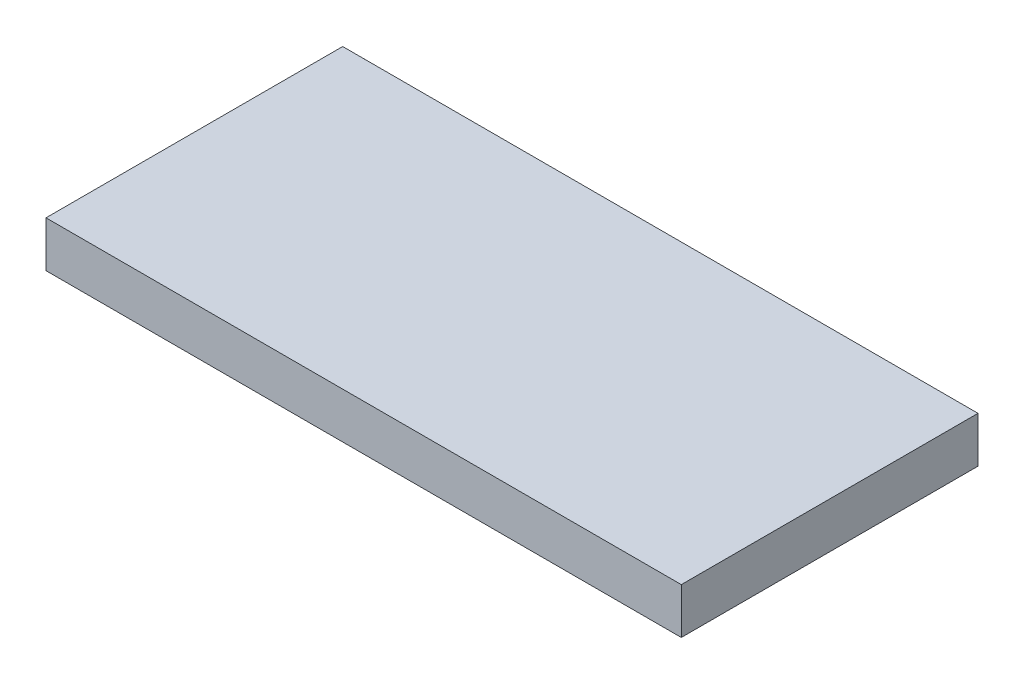
ISO-10303-21;
HEADER;
FILE_DESCRIPTION(('STEP AP214'),'2;1');
FILE_NAME('part.step','',(''),(''),'','','');
FILE_SCHEMA(('AUTOMOTIVE_DESIGN { 1 0 10303 214 1 1 1 1 }'));
ENDSEC;
DATA;
#1=APPLICATION_CONTEXT('core data for automotive mechanical design processes');
#2=APPLICATION_PROTOCOL_DEFINITION('international standard','automotive_design',2000,#1);
#3=PRODUCT_CONTEXT('',#1,'mechanical');
#4=PRODUCT('Part','Part','',(#3));
#5=PRODUCT_RELATED_PRODUCT_CATEGORY('part','',(#4));
#6=PRODUCT_DEFINITION_FORMATION('','',#4);
#7=PRODUCT_DEFINITION_CONTEXT('part definition',#1,'design');
#8=PRODUCT_DEFINITION('design','',#6,#7);
#9=PRODUCT_DEFINITION_SHAPE('','',#8);
#10=(LENGTH_UNIT() NAMED_UNIT(*) SI_UNIT(.MILLI.,.METRE.));
#11=(NAMED_UNIT(*) PLANE_ANGLE_UNIT() SI_UNIT($,.RADIAN.));
#12=(NAMED_UNIT(*) SI_UNIT($,.STERADIAN.) SOLID_ANGLE_UNIT());
#13=UNCERTAINTY_MEASURE_WITH_UNIT(LENGTH_MEASURE(1.E-05),#10,'distance_accuracy_value','');
#14=(GEOMETRIC_REPRESENTATION_CONTEXT(3) GLOBAL_UNCERTAINTY_ASSIGNED_CONTEXT((#13)) GLOBAL_UNIT_ASSIGNED_CONTEXT((#10,
#11,#12)) REPRESENTATION_CONTEXT('',''));
#15=CARTESIAN_POINT('',(0.,0.,0.));
#16=DIRECTION('',(0.,0.,1.));
#17=DIRECTION('',(1.,0.,0.));
#18=AXIS2_PLACEMENT_3D('',#15,#16,#17);
#19=CARTESIAN_POINT('',(0.,-4.7752,0.));
#20=DIRECTION('',(-1.,0.,0.));
#21=DIRECTION('',(0.,0.,1.));
#22=AXIS2_PLACEMENT_3D('',#19,#20,#21);
#23=PLANE('',#22);
#24=DIRECTION('',(0.,0.,1.));
#25=VECTOR('',#24,1.);
#26=CARTESIAN_POINT('',(0.,0.,0.));
#27=LINE('',#26,#25);
#28=CARTESIAN_POINT('',(0.,0.,-30.9372));
#29=VERTEX_POINT('',#28);
#30=CARTESIAN_POINT('',(0.,0.,0.));
#31=VERTEX_POINT('',#30);
#32=EDGE_CURVE('E97',#29,#31,#27,.T.);
#33=ORIENTED_EDGE('',*,*,#32,.F.);
#34=DIRECTION('',(0.,1.,0.));
#35=VECTOR('',#34,1.);
#36=CARTESIAN_POINT('',(0.,-4.7752,-30.9372));
#37=LINE('',#36,#35);
#38=CARTESIAN_POINT('',(0.,-4.7752,-30.9372));
#39=VERTEX_POINT('',#38);
#40=EDGE_CURVE('E11',#39,#29,#37,.T.);
#41=ORIENTED_EDGE('',*,*,#40,.F.);
#42=DIRECTION('',(0.,0.,1.));
#43=VECTOR('',#42,1.);
#44=CARTESIAN_POINT('',(0.,-4.7752,0.));
#45=LINE('',#44,#43);
#46=CARTESIAN_POINT('',(0.,-4.7752,0.));
#47=VERTEX_POINT('',#46);
#48=EDGE_CURVE('E91',#39,#47,#45,.T.);
#49=ORIENTED_EDGE('',*,*,#48,.T.);
#50=DIRECTION('',(0.,1.,0.));
#51=VECTOR('',#50,1.);
#52=CARTESIAN_POINT('',(0.,-4.7752,0.));
#53=LINE('',#52,#51);
#54=EDGE_CURVE('E36',#47,#31,#53,.T.);
#55=ORIENTED_EDGE('',*,*,#54,.T.);
#56=EDGE_LOOP('',(#33,#41,#49,#55));
#57=FACE_BOUND('',#56,.T.);
#58=ADVANCED_FACE('F33',(#57),#23,.T.);
#59=CARTESIAN_POINT('',(0.,-4.7752,-30.9372));
#60=DIRECTION('',(0.,0.,-1.));
#61=DIRECTION('',(-1.,0.,0.));
#62=AXIS2_PLACEMENT_3D('',#59,#60,#61);
#63=PLANE('',#62);
#64=DIRECTION('',(-1.,0.,0.));
#65=VECTOR('',#64,1.);
#66=CARTESIAN_POINT('',(0.,0.,-30.9372));
#67=LINE('',#66,#65);
#68=CARTESIAN_POINT('',(66.2458205568163,0.,-30.9372));
#69=VERTEX_POINT('',#68);
#70=EDGE_CURVE('E93',#69,#29,#67,.T.);
#71=ORIENTED_EDGE('',*,*,#70,.F.);
#72=DIRECTION('',(0.,1.,0.));
#73=VECTOR('',#72,1.);
#74=CARTESIAN_POINT('',(66.2458205568163,-4.7752,-30.9372));
#75=LINE('',#74,#73);
#76=CARTESIAN_POINT('',(66.2458205568163,-4.7752,-30.9372));
#77=VERTEX_POINT('',#76);
#78=EDGE_CURVE('E42',#77,#69,#75,.T.);
#79=ORIENTED_EDGE('',*,*,#78,.F.);
#80=DIRECTION('',(-1.,0.,0.));
#81=VECTOR('',#80,1.);
#82=CARTESIAN_POINT('',(0.,-4.7752,-30.9372));
#83=LINE('',#82,#81);
#84=EDGE_CURVE('E88',#77,#39,#83,.T.);
#85=ORIENTED_EDGE('',*,*,#84,.T.);
#86=ORIENTED_EDGE('',*,*,#40,.T.);
#87=EDGE_LOOP('',(#71,#79,#85,#86));
#88=FACE_BOUND('',#87,.T.);
#89=ADVANCED_FACE('F107',(#88),#63,.T.);
#90=CARTESIAN_POINT('',(66.2458205568163,-4.7752,0.));
#91=DIRECTION('',(1.,0.,0.));
#92=DIRECTION('',(0.,0.,-1.));
#93=AXIS2_PLACEMENT_3D('',#90,#91,#92);
#94=PLANE('',#93);
#95=DIRECTION('',(0.,0.,-1.));
#96=VECTOR('',#95,1.);
#97=CARTESIAN_POINT('',(66.2458205568163,0.,0.));
#98=LINE('',#97,#96);
#99=CARTESIAN_POINT('',(66.2458205568163,0.,0.));
#100=VERTEX_POINT('',#99);
#101=EDGE_CURVE('E83',#100,#69,#98,.T.);
#102=ORIENTED_EDGE('',*,*,#101,.F.);
#103=DIRECTION('',(0.,1.,0.));
#104=VECTOR('',#103,1.);
#105=CARTESIAN_POINT('',(66.2458205568163,-4.7752,0.));
#106=LINE('',#105,#104);
#107=CARTESIAN_POINT('',(66.2458205568163,-4.7752,0.));
#108=VERTEX_POINT('',#107);
#109=EDGE_CURVE('E78',#108,#100,#106,.T.);
#110=ORIENTED_EDGE('',*,*,#109,.F.);
#111=DIRECTION('',(0.,0.,-1.));
#112=VECTOR('',#111,1.);
#113=CARTESIAN_POINT('',(66.2458205568163,-4.7752,0.));
#114=LINE('',#113,#112);
#115=EDGE_CURVE('E81',#108,#77,#114,.T.);
#116=ORIENTED_EDGE('',*,*,#115,.T.);
#117=ORIENTED_EDGE('',*,*,#78,.T.);
#118=EDGE_LOOP('',(#102,#110,#116,#117));
#119=FACE_BOUND('',#118,.T.);
#120=ADVANCED_FACE('F80',(#119),#94,.T.);
#121=CARTESIAN_POINT('',(0.,-4.7752,0.));
#122=DIRECTION('',(0.,0.,1.));
#123=DIRECTION('',(1.,0.,0.));
#124=AXIS2_PLACEMENT_3D('',#121,#122,#123);
#125=PLANE('',#124);
#126=DIRECTION('',(1.,0.,0.));
#127=VECTOR('',#126,1.);
#128=CARTESIAN_POINT('',(0.,0.,0.));
#129=LINE('',#128,#127);
#130=EDGE_CURVE('E100',#31,#100,#129,.T.);
#131=ORIENTED_EDGE('',*,*,#130,.F.);
#132=ORIENTED_EDGE('',*,*,#54,.F.);
#133=DIRECTION('',(1.,0.,0.));
#134=VECTOR('',#133,1.);
#135=CARTESIAN_POINT('',(0.,-4.7752,0.));
#136=LINE('',#135,#134);
#137=EDGE_CURVE('E87',#47,#108,#136,.T.);
#138=ORIENTED_EDGE('',*,*,#137,.T.);
#139=ORIENTED_EDGE('',*,*,#109,.T.);
#140=EDGE_LOOP('',(#131,#132,#138,#139));
#141=FACE_BOUND('',#140,.T.);
#142=ADVANCED_FACE('F90',(#141),#125,.T.);
#143=CARTESIAN_POINT('',(0.,-4.7752,-30.9372));
#144=DIRECTION('',(0.,-1.,0.));
#145=DIRECTION('',(0.,0.,-1.));
#146=AXIS2_PLACEMENT_3D('',#143,#144,#145);
#147=PLANE('',#146);
#148=ORIENTED_EDGE('',*,*,#48,.F.);
#149=ORIENTED_EDGE('',*,*,#84,.F.);
#150=ORIENTED_EDGE('',*,*,#115,.F.);
#151=ORIENTED_EDGE('',*,*,#137,.F.);
#152=EDGE_LOOP('',(#148,#149,#150,#151));
#153=FACE_BOUND('',#152,.T.);
#154=ADVANCED_FACE('F86',(#153),#147,.T.);
#155=CARTESIAN_POINT('',(0.,0.,-30.9372));
#156=DIRECTION('',(0.,-1.,0.));
#157=DIRECTION('',(0.,0.,-1.));
#158=AXIS2_PLACEMENT_3D('',#155,#156,#157);
#159=PLANE('',#158);
#160=ORIENTED_EDGE('',*,*,#32,.T.);
#161=ORIENTED_EDGE('',*,*,#130,.T.);
#162=ORIENTED_EDGE('',*,*,#101,.T.);
#163=ORIENTED_EDGE('',*,*,#70,.T.);
#164=EDGE_LOOP('',(#160,#161,#162,#163));
#165=FACE_BOUND('',#164,.T.);
#166=ADVANCED_FACE('F106',(#165),#159,.F.);
#167=CLOSED_SHELL('',(#58,#89,#120,#142,#154,#166));
#168=MANIFOLD_SOLID_BREP('B2',#167);
#169=ADVANCED_BREP_SHAPE_REPRESENTATION('',(#18,#168),#14);
#170=SHAPE_DEFINITION_REPRESENTATION(#9,#169);
ENDSEC;
END-ISO-10303-21;
